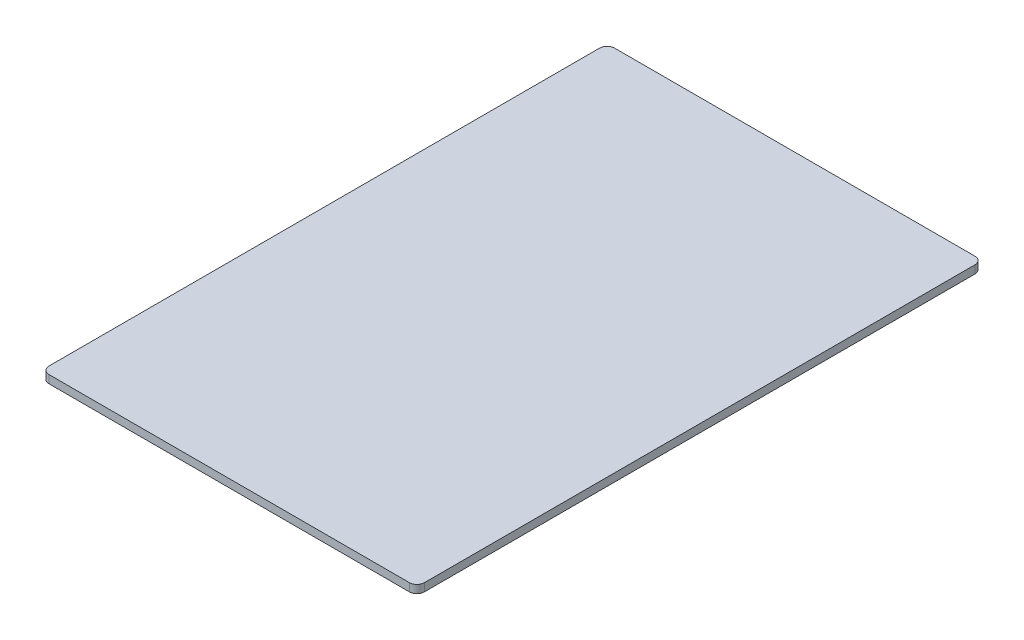
ISO-10303-21;
HEADER;
FILE_DESCRIPTION(('STEP AP214'),'2;1');
FILE_NAME('part.step','',(''),(''),'','','');
FILE_SCHEMA(('AUTOMOTIVE_DESIGN { 1 0 10303 214 1 1 1 1 }'));
ENDSEC;
DATA;
#1=APPLICATION_CONTEXT('core data for automotive mechanical design processes');
#2=APPLICATION_PROTOCOL_DEFINITION('international standard','automotive_design',2000,#1);
#3=PRODUCT_CONTEXT('',#1,'mechanical');
#4=PRODUCT('Part','Part','',(#3));
#5=PRODUCT_RELATED_PRODUCT_CATEGORY('part','',(#4));
#6=PRODUCT_DEFINITION_FORMATION('','',#4);
#7=PRODUCT_DEFINITION_CONTEXT('part definition',#1,'design');
#8=PRODUCT_DEFINITION('design','',#6,#7);
#9=PRODUCT_DEFINITION_SHAPE('','',#8);
#10=(LENGTH_UNIT() NAMED_UNIT(*) SI_UNIT(.MILLI.,.METRE.));
#11=(NAMED_UNIT(*) PLANE_ANGLE_UNIT() SI_UNIT($,.RADIAN.));
#12=(NAMED_UNIT(*) SI_UNIT($,.STERADIAN.) SOLID_ANGLE_UNIT());
#13=UNCERTAINTY_MEASURE_WITH_UNIT(LENGTH_MEASURE(1.E-05),#10,'distance_accuracy_value','');
#14=(GEOMETRIC_REPRESENTATION_CONTEXT(3) GLOBAL_UNCERTAINTY_ASSIGNED_CONTEXT((#13)) GLOBAL_UNIT_ASSIGNED_CONTEXT((#10,
#11,#12)) REPRESENTATION_CONTEXT('',''));
#15=CARTESIAN_POINT('',(0.,0.,0.));
#16=DIRECTION('',(0.,0.,1.));
#17=DIRECTION('',(1.,0.,0.));
#18=AXIS2_PLACEMENT_3D('',#15,#16,#17);
#19=CARTESIAN_POINT('',(25.2806257218328,1.6,113.));
#20=DIRECTION('',(1.,0.,0.));
#21=DIRECTION('',(0.,0.,-1.));
#22=AXIS2_PLACEMENT_3D('',#19,#20,#21);
#23=PLANE('',#22);
#24=DIRECTION('',(0.,0.,1.));
#25=VECTOR('',#24,1.);
#26=CARTESIAN_POINT('',(25.2806257218328,1.6,113.));
#27=LINE('',#26,#25);
#28=CARTESIAN_POINT('',(25.2806257218328,1.6,1.5));
#29=VERTEX_POINT('',#28);
#30=CARTESIAN_POINT('',(25.2806257218328,1.6,111.5));
#31=VERTEX_POINT('',#30);
#32=EDGE_CURVE('E129',#29,#31,#27,.T.);
#33=ORIENTED_EDGE('',*,*,#32,.F.);
#34=DIRECTION('',(0.,-1.,0.));
#35=VECTOR('',#34,1.);
#36=CARTESIAN_POINT('',(25.2806257218328,1.6,1.5));
#37=LINE('',#36,#35);
#38=CARTESIAN_POINT('',(25.2806257218328,0.,1.5));
#39=VERTEX_POINT('',#38);
#40=EDGE_CURVE('E11',#29,#39,#37,.T.);
#41=ORIENTED_EDGE('',*,*,#40,.T.);
#42=DIRECTION('',(0.,0.,1.));
#43=VECTOR('',#42,1.);
#44=CARTESIAN_POINT('',(25.2806257218328,0.,113.));
#45=LINE('',#44,#43);
#46=CARTESIAN_POINT('',(25.2806257218328,0.,111.5));
#47=VERTEX_POINT('',#46);
#48=EDGE_CURVE('E160',#39,#47,#45,.T.);
#49=ORIENTED_EDGE('',*,*,#48,.T.);
#50=DIRECTION('',(0.,-1.,0.));
#51=VECTOR('',#50,1.);
#52=CARTESIAN_POINT('',(25.2806257218328,1.6,111.5));
#53=LINE('',#52,#51);
#54=EDGE_CURVE('E43',#47,#31,#53,.F.);
#55=ORIENTED_EDGE('',*,*,#54,.T.);
#56=EDGE_LOOP('',(#33,#41,#49,#55));
#57=FACE_BOUND('',#56,.T.);
#58=ADVANCED_FACE('F35',(#57),#23,.F.);
#59=CARTESIAN_POINT('',(100.280625721833,1.6,113.));
#60=DIRECTION('',(0.,0.,-1.));
#61=DIRECTION('',(-1.,0.,0.));
#62=AXIS2_PLACEMENT_3D('',#59,#60,#61);
#63=PLANE('',#62);
#64=DIRECTION('',(1.,0.,0.));
#65=VECTOR('',#64,1.);
#66=CARTESIAN_POINT('',(100.280625721833,0.,113.));
#67=LINE('',#66,#65);
#68=CARTESIAN_POINT('',(26.7806257218328,0.,113.));
#69=VERTEX_POINT('',#68);
#70=CARTESIAN_POINT('',(98.7806257218328,0.,113.));
#71=VERTEX_POINT('',#70);
#72=EDGE_CURVE('E134',#69,#71,#67,.T.);
#73=ORIENTED_EDGE('',*,*,#72,.T.);
#74=DIRECTION('',(0.,-1.,0.));
#75=VECTOR('',#74,1.);
#76=CARTESIAN_POINT('',(98.7806257218328,1.6,113.));
#77=LINE('',#76,#75);
#78=CARTESIAN_POINT('',(98.7806257218328,1.6,113.));
#79=VERTEX_POINT('',#78);
#80=EDGE_CURVE('E50',#71,#79,#77,.F.);
#81=ORIENTED_EDGE('',*,*,#80,.T.);
#82=DIRECTION('',(1.,0.,0.));
#83=VECTOR('',#82,1.);
#84=CARTESIAN_POINT('',(100.280625721833,1.6,113.));
#85=LINE('',#84,#83);
#86=CARTESIAN_POINT('',(26.7806257218328,1.6,113.));
#87=VERTEX_POINT('',#86);
#88=EDGE_CURVE('E132',#87,#79,#85,.T.);
#89=ORIENTED_EDGE('',*,*,#88,.F.);
#90=DIRECTION('',(0.,-1.,0.));
#91=VECTOR('',#90,1.);
#92=CARTESIAN_POINT('',(26.7806257218328,1.6,113.));
#93=LINE('',#92,#91);
#94=EDGE_CURVE('E152',#87,#69,#93,.T.);
#95=ORIENTED_EDGE('',*,*,#94,.T.);
#96=EDGE_LOOP('',(#73,#81,#89,#95));
#97=FACE_BOUND('',#96,.T.);
#98=ADVANCED_FACE('F167',(#97),#63,.F.);
#99=CARTESIAN_POINT('',(100.280625721833,1.6,0.));
#100=DIRECTION('',(-1.,0.,0.));
#101=DIRECTION('',(0.,0.,1.));
#102=AXIS2_PLACEMENT_3D('',#99,#100,#101);
#103=PLANE('',#102);
#104=DIRECTION('',(0.,0.,-1.));
#105=VECTOR('',#104,1.);
#106=CARTESIAN_POINT('',(100.280625721833,0.,0.));
#107=LINE('',#106,#105);
#108=CARTESIAN_POINT('',(100.280625721833,0.,111.5));
#109=VERTEX_POINT('',#108);
#110=CARTESIAN_POINT('',(100.280625721833,0.,1.5));
#111=VERTEX_POINT('',#110);
#112=EDGE_CURVE('E130',#109,#111,#107,.T.);
#113=ORIENTED_EDGE('',*,*,#112,.T.);
#114=DIRECTION('',(0.,-1.,0.));
#115=VECTOR('',#114,1.);
#116=CARTESIAN_POINT('',(100.280625721833,1.6,1.5));
#117=LINE('',#116,#115);
#118=CARTESIAN_POINT('',(100.280625721833,1.6,1.5));
#119=VERTEX_POINT('',#118);
#120=EDGE_CURVE('E107',#111,#119,#117,.F.);
#121=ORIENTED_EDGE('',*,*,#120,.T.);
#122=DIRECTION('',(0.,0.,-1.));
#123=VECTOR('',#122,1.);
#124=CARTESIAN_POINT('',(100.280625721833,1.6,0.));
#125=LINE('',#124,#123);
#126=CARTESIAN_POINT('',(100.280625721833,1.6,111.5));
#127=VERTEX_POINT('',#126);
#128=EDGE_CURVE('E171',#127,#119,#125,.T.);
#129=ORIENTED_EDGE('',*,*,#128,.F.);
#130=DIRECTION('',(0.,-1.,0.));
#131=VECTOR('',#130,1.);
#132=CARTESIAN_POINT('',(100.280625721833,1.6,111.5));
#133=LINE('',#132,#131);
#134=EDGE_CURVE('E112',#127,#109,#133,.T.);
#135=ORIENTED_EDGE('',*,*,#134,.T.);
#136=EDGE_LOOP('',(#113,#121,#129,#135));
#137=FACE_BOUND('',#136,.T.);
#138=ADVANCED_FACE('F179',(#137),#103,.F.);
#139=CARTESIAN_POINT('',(25.2806257218328,1.6,0.));
#140=DIRECTION('',(0.,0.,1.));
#141=DIRECTION('',(1.,0.,0.));
#142=AXIS2_PLACEMENT_3D('',#139,#140,#141);
#143=PLANE('',#142);
#144=DIRECTION('',(-1.,0.,0.));
#145=VECTOR('',#144,1.);
#146=CARTESIAN_POINT('',(25.2806257218328,1.6,0.));
#147=LINE('',#146,#145);
#148=CARTESIAN_POINT('',(98.7806257218328,1.6,0.));
#149=VERTEX_POINT('',#148);
#150=CARTESIAN_POINT('',(26.7806257218328,1.6,0.));
#151=VERTEX_POINT('',#150);
#152=EDGE_CURVE('E122',#149,#151,#147,.T.);
#153=ORIENTED_EDGE('',*,*,#152,.F.);
#154=DIRECTION('',(0.,-1.,0.));
#155=VECTOR('',#154,1.);
#156=CARTESIAN_POINT('',(98.7806257218328,1.6,0.));
#157=LINE('',#156,#155);
#158=CARTESIAN_POINT('',(98.7806257218328,0.,0.));
#159=VERTEX_POINT('',#158);
#160=EDGE_CURVE('E106',#149,#159,#157,.T.);
#161=ORIENTED_EDGE('',*,*,#160,.T.);
#162=DIRECTION('',(-1.,0.,0.));
#163=VECTOR('',#162,1.);
#164=CARTESIAN_POINT('',(25.2806257218328,0.,0.));
#165=LINE('',#164,#163);
#166=CARTESIAN_POINT('',(26.7806257218328,0.,0.));
#167=VERTEX_POINT('',#166);
#168=EDGE_CURVE('E119',#159,#167,#165,.T.);
#169=ORIENTED_EDGE('',*,*,#168,.T.);
#170=DIRECTION('',(0.,-1.,0.));
#171=VECTOR('',#170,1.);
#172=CARTESIAN_POINT('',(26.7806257218328,1.6,0.));
#173=LINE('',#172,#171);
#174=EDGE_CURVE('E124',#167,#151,#173,.F.);
#175=ORIENTED_EDGE('',*,*,#174,.T.);
#176=EDGE_LOOP('',(#153,#161,#169,#175));
#177=FACE_BOUND('',#176,.T.);
#178=ADVANCED_FACE('F118',(#177),#143,.F.);
#179=CARTESIAN_POINT('',(0.,1.6,0.));
#180=DIRECTION('',(0.,-1.,0.));
#181=DIRECTION('',(0.,0.,-1.));
#182=AXIS2_PLACEMENT_3D('',#179,#180,#181);
#183=PLANE('',#182);
#184=ORIENTED_EDGE('',*,*,#128,.T.);
#185=CARTESIAN_POINT('',(98.7806257218328,1.6,1.5));
#186=DIRECTION('',(0.,-1.,0.));
#187=DIRECTION('',(0.,0.,-1.));
#188=AXIS2_PLACEMENT_3D('',#185,#186,#187);
#189=CIRCLE('',#188,1.5);
#190=EDGE_CURVE('E150',#119,#149,#189,.F.);
#191=ORIENTED_EDGE('',*,*,#190,.T.);
#192=ORIENTED_EDGE('',*,*,#152,.T.);
#193=CARTESIAN_POINT('',(26.7806257218328,1.6,1.5));
#194=DIRECTION('',(0.,-1.,0.));
#195=DIRECTION('',(0.,0.,-1.));
#196=AXIS2_PLACEMENT_3D('',#193,#194,#195);
#197=CIRCLE('',#196,1.5);
#198=EDGE_CURVE('E146',#151,#29,#197,.F.);
#199=ORIENTED_EDGE('',*,*,#198,.T.);
#200=ORIENTED_EDGE('',*,*,#32,.T.);
#201=CARTESIAN_POINT('',(26.7806257218328,1.6,111.5));
#202=DIRECTION('',(0.,-1.,0.));
#203=DIRECTION('',(0.,0.,-1.));
#204=AXIS2_PLACEMENT_3D('',#201,#202,#203);
#205=CIRCLE('',#204,1.5);
#206=EDGE_CURVE('E57',#31,#87,#205,.F.);
#207=ORIENTED_EDGE('',*,*,#206,.T.);
#208=ORIENTED_EDGE('',*,*,#88,.T.);
#209=CARTESIAN_POINT('',(98.7806257218328,1.6,111.5));
#210=DIRECTION('',(0.,-1.,0.));
#211=DIRECTION('',(0.,0.,-1.));
#212=AXIS2_PLACEMENT_3D('',#209,#210,#211);
#213=CIRCLE('',#212,1.5);
#214=EDGE_CURVE('E148',#79,#127,#213,.F.);
#215=ORIENTED_EDGE('',*,*,#214,.T.);
#216=EDGE_LOOP('',(#184,#191,#192,#199,#200,#207,#208,#215));
#217=FACE_BOUND('',#216,.T.);
#218=ADVANCED_FACE('F163',(#217),#183,.F.);
#219=CARTESIAN_POINT('',(0.,0.,0.));
#220=DIRECTION('',(0.,-1.,0.));
#221=DIRECTION('',(0.,0.,-1.));
#222=AXIS2_PLACEMENT_3D('',#219,#220,#221);
#223=PLANE('',#222);
#224=ORIENTED_EDGE('',*,*,#168,.F.);
#225=CARTESIAN_POINT('',(98.7806257218328,0.,1.5));
#226=DIRECTION('',(0.,-1.,0.));
#227=DIRECTION('',(0.,0.,-1.));
#228=AXIS2_PLACEMENT_3D('',#225,#226,#227);
#229=CIRCLE('',#228,1.5);
#230=EDGE_CURVE('E102',#159,#111,#229,.T.);
#231=ORIENTED_EDGE('',*,*,#230,.T.);
#232=ORIENTED_EDGE('',*,*,#112,.F.);
#233=CARTESIAN_POINT('',(98.7806257218328,0.,111.5));
#234=DIRECTION('',(0.,-1.,0.));
#235=DIRECTION('',(0.,0.,-1.));
#236=AXIS2_PLACEMENT_3D('',#233,#234,#235);
#237=CIRCLE('',#236,1.5);
#238=EDGE_CURVE('E113',#109,#71,#237,.T.);
#239=ORIENTED_EDGE('',*,*,#238,.T.);
#240=ORIENTED_EDGE('',*,*,#72,.F.);
#241=CARTESIAN_POINT('',(26.7806257218328,0.,111.5));
#242=DIRECTION('',(0.,-1.,0.));
#243=DIRECTION('',(0.,0.,-1.));
#244=AXIS2_PLACEMENT_3D('',#241,#242,#243);
#245=CIRCLE('',#244,1.5);
#246=EDGE_CURVE('E123',#69,#47,#245,.T.);
#247=ORIENTED_EDGE('',*,*,#246,.T.);
#248=ORIENTED_EDGE('',*,*,#48,.F.);
#249=CARTESIAN_POINT('',(26.7806257218328,0.,1.5));
#250=DIRECTION('',(0.,-1.,0.));
#251=DIRECTION('',(0.,0.,-1.));
#252=AXIS2_PLACEMENT_3D('',#249,#250,#251);
#253=CIRCLE('',#252,1.5);
#254=EDGE_CURVE('E128',#39,#167,#253,.T.);
#255=ORIENTED_EDGE('',*,*,#254,.T.);
#256=EDGE_LOOP('',(#224,#231,#232,#239,#240,#247,#248,#255));
#257=FACE_BOUND('',#256,.T.);
#258=ADVANCED_FACE('F126',(#257),#223,.T.);
#259=CARTESIAN_POINT('',(98.7806257218328,1.6,1.5));
#260=DIRECTION('',(0.,-1.,0.));
#261=DIRECTION('',(0.,0.,-1.));
#262=AXIS2_PLACEMENT_3D('',#259,#260,#261);
#263=CYLINDRICAL_SURFACE('',#262,1.5);
#264=ORIENTED_EDGE('',*,*,#190,.F.);
#265=ORIENTED_EDGE('',*,*,#120,.F.);
#266=ORIENTED_EDGE('',*,*,#230,.F.);
#267=ORIENTED_EDGE('',*,*,#160,.F.);
#268=EDGE_LOOP('',(#264,#265,#266,#267));
#269=FACE_BOUND('',#268,.T.);
#270=ADVANCED_FACE('F105',(#269),#263,.T.);
#271=CARTESIAN_POINT('',(98.7806257218328,1.6,111.5));
#272=DIRECTION('',(0.,-1.,0.));
#273=DIRECTION('',(0.,0.,-1.));
#274=AXIS2_PLACEMENT_3D('',#271,#272,#273);
#275=CYLINDRICAL_SURFACE('',#274,1.5);
#276=ORIENTED_EDGE('',*,*,#214,.F.);
#277=ORIENTED_EDGE('',*,*,#80,.F.);
#278=ORIENTED_EDGE('',*,*,#238,.F.);
#279=ORIENTED_EDGE('',*,*,#134,.F.);
#280=EDGE_LOOP('',(#276,#277,#278,#279));
#281=FACE_BOUND('',#280,.T.);
#282=ADVANCED_FACE('F177',(#281),#275,.T.);
#283=CARTESIAN_POINT('',(26.7806257218328,1.6,1.5));
#284=DIRECTION('',(0.,-1.,0.));
#285=DIRECTION('',(0.,0.,-1.));
#286=AXIS2_PLACEMENT_3D('',#283,#284,#285);
#287=CYLINDRICAL_SURFACE('',#286,1.5);
#288=ORIENTED_EDGE('',*,*,#198,.F.);
#289=ORIENTED_EDGE('',*,*,#174,.F.);
#290=ORIENTED_EDGE('',*,*,#254,.F.);
#291=ORIENTED_EDGE('',*,*,#40,.F.);
#292=EDGE_LOOP('',(#288,#289,#290,#291));
#293=FACE_BOUND('',#292,.T.);
#294=ADVANCED_FACE('F181',(#293),#287,.T.);
#295=CARTESIAN_POINT('',(26.7806257218328,1.6,111.5));
#296=DIRECTION('',(0.,-1.,0.));
#297=DIRECTION('',(0.,0.,-1.));
#298=AXIS2_PLACEMENT_3D('',#295,#296,#297);
#299=CYLINDRICAL_SURFACE('',#298,1.5);
#300=ORIENTED_EDGE('',*,*,#206,.F.);
#301=ORIENTED_EDGE('',*,*,#54,.F.);
#302=ORIENTED_EDGE('',*,*,#246,.F.);
#303=ORIENTED_EDGE('',*,*,#94,.F.);
#304=EDGE_LOOP('',(#300,#301,#302,#303));
#305=FACE_BOUND('',#304,.T.);
#306=ADVANCED_FACE('F37',(#305),#299,.T.);
#307=CLOSED_SHELL('',(#58,#98,#138,#178,#218,#258,#270,#282,#294,#306));
#308=MANIFOLD_SOLID_BREP('B2',#307);
#309=ADVANCED_BREP_SHAPE_REPRESENTATION('',(#18,#308),#14);
#310=SHAPE_DEFINITION_REPRESENTATION(#9,#309);
ENDSEC;
END-ISO-10303-21;
